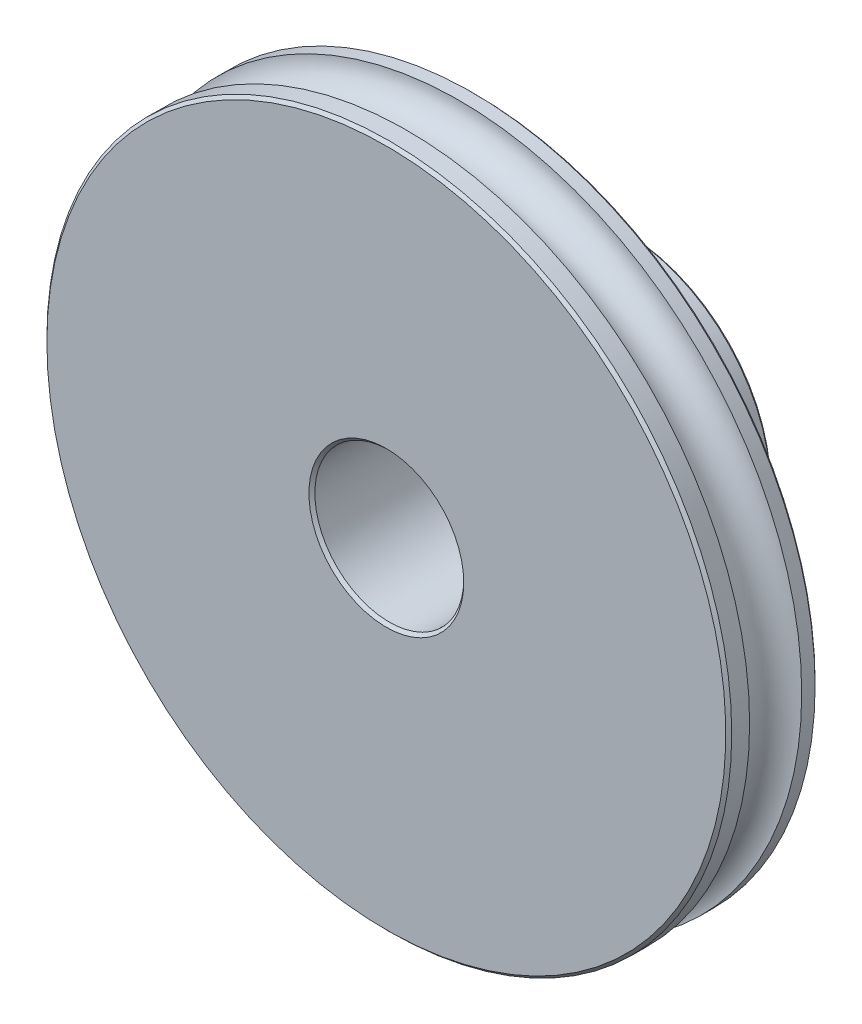
ISO-10303-21;
HEADER;
FILE_DESCRIPTION(('STEP AP214'),'2;1');
FILE_NAME('part.step','',(''),(''),'','','');
FILE_SCHEMA(('AUTOMOTIVE_DESIGN { 1 0 10303 214 1 1 1 1 }'));
ENDSEC;
DATA;
#1=APPLICATION_CONTEXT('core data for automotive mechanical design processes');
#2=APPLICATION_PROTOCOL_DEFINITION('international standard','automotive_design',2000,#1);
#3=PRODUCT_CONTEXT('',#1,'mechanical');
#4=PRODUCT('Part','Part','',(#3));
#5=PRODUCT_RELATED_PRODUCT_CATEGORY('part','',(#4));
#6=PRODUCT_DEFINITION_FORMATION('','',#4);
#7=PRODUCT_DEFINITION_CONTEXT('part definition',#1,'design');
#8=PRODUCT_DEFINITION('design','',#6,#7);
#9=PRODUCT_DEFINITION_SHAPE('','',#8);
#10=(LENGTH_UNIT() NAMED_UNIT(*) SI_UNIT(.MILLI.,.METRE.));
#11=(NAMED_UNIT(*) PLANE_ANGLE_UNIT() SI_UNIT($,.RADIAN.));
#12=(NAMED_UNIT(*) SI_UNIT($,.STERADIAN.) SOLID_ANGLE_UNIT());
#13=UNCERTAINTY_MEASURE_WITH_UNIT(LENGTH_MEASURE(1.E-05),#10,'distance_accuracy_value','');
#14=(GEOMETRIC_REPRESENTATION_CONTEXT(3) GLOBAL_UNCERTAINTY_ASSIGNED_CONTEXT((#13)) GLOBAL_UNIT_ASSIGNED_CONTEXT((#10,
#11,#12)) REPRESENTATION_CONTEXT('',''));
#15=CARTESIAN_POINT('',(0.,0.,0.));
#16=DIRECTION('',(0.,0.,1.));
#17=DIRECTION('',(1.,0.,0.));
#18=AXIS2_PLACEMENT_3D('',#15,#16,#17);
#19=CARTESIAN_POINT('',(0.,23.,-0.861588835659818));
#20=DIRECTION('',(0.,0.,-1.));
#21=DIRECTION('',(-1.,0.,0.));
#22=AXIS2_PLACEMENT_3D('',#19,#20,#21);
#23=PLANE('',#22);
#24=CARTESIAN_POINT('',(0.,0.,-0.861588835659818));
#25=DIRECTION('',(0.,0.,-1.));
#26=DIRECTION('',(-1.,0.,0.));
#27=AXIS2_PLACEMENT_3D('',#24,#25,#26);
#28=CIRCLE('',#27,22.8);
#29=CARTESIAN_POINT('',(-22.8,0.,-0.861588835659818));
#30=VERTEX_POINT('',#29);
#31=EDGE_CURVE('E70',#30,#30,#28,.F.);
#32=ORIENTED_EDGE('',*,*,#31,.T.);
#33=EDGE_LOOP('',(#32));
#34=FACE_BOUND('',#33,.T.);
#35=CARTESIAN_POINT('',(0.,0.,-0.861588835659818));
#36=DIRECTION('',(0.,0.,-1.));
#37=DIRECTION('',(-1.,0.,0.));
#38=AXIS2_PLACEMENT_3D('',#35,#36,#37);
#39=CIRCLE('',#38,5.20000000000002);
#40=CARTESIAN_POINT('',(5.20000000000002,0.,-0.861588835659817));
#41=VERTEX_POINT('',#40);
#42=EDGE_CURVE('E73',#41,#41,#39,.T.);
#43=ORIENTED_EDGE('',*,*,#42,.T.);
#44=EDGE_LOOP('',(#43));
#45=FACE_BOUND('',#44,.T.);
#46=ADVANCED_FACE('F32',(#34,#45),#23,.F.);
#47=CARTESIAN_POINT('',(0.,0.,0.));
#48=DIRECTION('',(0.,0.,1.));
#49=DIRECTION('',(1.,0.,0.));
#50=AXIS2_PLACEMENT_3D('',#47,#48,#49);
#51=CYLINDRICAL_SURFACE('',#50,5.);
#52=CARTESIAN_POINT('',(0.,0.,-1.06158883565983));
#53=DIRECTION('',(0.,0.,-1.));
#54=DIRECTION('',(-1.,0.,0.));
#55=AXIS2_PLACEMENT_3D('',#52,#53,#54);
#56=CIRCLE('',#55,5.);
#57=CARTESIAN_POINT('',(5.,0.,-1.06158883565983));
#58=VERTEX_POINT('',#57);
#59=EDGE_CURVE('E61',#58,#58,#56,.F.);
#60=ORIENTED_EDGE('',*,*,#59,.T.);
#61=EDGE_LOOP('',(#60));
#62=FACE_BOUND('',#61,.T.);
#63=CARTESIAN_POINT('',(0.,0.,-16.6615888356598));
#64=DIRECTION('',(0.,0.,1.));
#65=DIRECTION('',(1.,0.,0.));
#66=AXIS2_PLACEMENT_3D('',#63,#64,#65);
#67=CIRCLE('',#66,5.);
#68=CARTESIAN_POINT('',(5.,0.,-16.6615888356598));
#69=VERTEX_POINT('',#68);
#70=EDGE_CURVE('E64',#69,#69,#67,.F.);
#71=ORIENTED_EDGE('',*,*,#70,.T.);
#72=EDGE_LOOP('',(#71));
#73=FACE_BOUND('',#72,.T.);
#74=CARTESIAN_POINT('',(-4.96862696659688,-0.559237039909071,-12.));
#75=CARTESIAN_POINT('',(-4.96862859249291,-0.559243289457601,-12.107123689713));
#76=CARTESIAN_POINT('',(-4.96759621596919,-0.568639638396946,-12.2144262943318));
#77=CARTESIAN_POINT('',(-4.96321242143705,-0.605685583446096,-12.4259390840996));
#78=CARTESIAN_POINT('',(-4.95985507656293,-0.633381821781542,-12.5301406543385));
#79=CARTESIAN_POINT('',(-4.95013279271216,-0.70532671319419,-12.7320518089708));
#80=CARTESIAN_POINT('',(-4.94377916366208,-0.749512992354578,-12.8297842432912));
#81=CARTESIAN_POINT('',(-4.92709439411533,-0.85231571948194,-13.0168853548623));
#82=CARTESIAN_POINT('',(-4.91676412185841,-0.9109290165217,-13.1062558525241));
#83=CARTESIAN_POINT('',(-4.89035131426753,-1.04368028807413,-13.2792603145443));
#84=CARTESIAN_POINT('',(-4.87399824176396,-1.11846574971558,-13.3623563993972));
#85=CARTESIAN_POINT('',(-4.83440103494086,-1.27882094162444,-13.5155290208558));
#86=CARTESIAN_POINT('',(-4.81115449983773,-1.36439442305267,-13.5856010077097));
#87=CARTESIAN_POINT('',(-4.75562894304013,-1.54707720153733,-13.7134063903097));
#88=CARTESIAN_POINT('',(-4.72302989904364,-1.64450832144093,-13.7705442996859));
#89=CARTESIAN_POINT('',(-4.64854037386128,-1.84457044548736,-13.8668435701738));
#90=CARTESIAN_POINT('',(-4.6066536838339,-1.94719931479035,-13.9060122462489));
#91=CARTESIAN_POINT('',(-4.51595175553996,-2.1489086146871,-13.9633414859931));
#92=CARTESIAN_POINT('',(-4.46757012568838,-2.2479202913434,-13.9824273139702));
#93=CARTESIAN_POINT('',(-4.36345569416926,-2.44387925487172,-14.0020284857814));
#94=CARTESIAN_POINT('',(-4.30772564210192,-2.54082729822334,-14.0025507559658));
#95=CARTESIAN_POINT('',(-4.19400482275432,-2.72420981621286,-13.9855172301958));
#96=CARTESIAN_POINT('',(-4.13631687002834,-2.81092896033634,-13.9689752272453));
#97=CARTESIAN_POINT('',(-4.01800452803478,-2.97759784178477,-13.920007123697));
#98=CARTESIAN_POINT('',(-3.95737992359995,-3.05754708189868,-13.8875798576015));
#99=CARTESIAN_POINT('',(-3.83456466878181,-3.21027565791072,-13.8073635171217));
#100=CARTESIAN_POINT('',(-3.77236418658483,-3.28292877350629,-13.7593502851846));
#101=CARTESIAN_POINT('',(-3.64976595242591,-3.41871163826879,-13.6495349930808));
#102=CARTESIAN_POINT('',(-3.58936882639931,-3.4818381109155,-13.5877282068998));
#103=CARTESIAN_POINT('',(-3.46905503463101,-3.60185316928892,-13.4473508640561));
#104=CARTESIAN_POINT('',(-3.40943025780958,-3.65806009884632,-13.3679461074272));
#105=CARTESIAN_POINT('',(-3.29811057891565,-3.75873812780293,-13.197009428168));
#106=CARTESIAN_POINT('',(-3.24641827407092,-3.80320538685062,-13.1054735518044));
#107=CARTESIAN_POINT('',(-3.15272569749143,-3.88125685779727,-12.9095809776261));
#108=CARTESIAN_POINT('',(-3.11104043534905,-3.91449818272839,-12.8049351696613));
#109=CARTESIAN_POINT('',(-3.04247573937433,-3.96802924548966,-12.5877845096878));
#110=CARTESIAN_POINT('',(-3.01558669013471,-3.98832739588443,-12.4752848152734));
#111=CARTESIAN_POINT('',(-2.98010480472115,-4.01490226039714,-12.2529642225326));
#112=CARTESIAN_POINT('',(-2.97049456344194,-4.02195982163418,-12.1433995528714));
#113=CARTESIAN_POINT('',(-2.96725678579678,-4.02435044527722,-11.9239227922404));
#114=CARTESIAN_POINT('',(-2.97362440268529,-4.01968706312966,-11.8140108167243));
#115=CARTESIAN_POINT('',(-3.00095371759313,-3.99931657714825,-11.6035410650431));
#116=CARTESIAN_POINT('',(-3.021063545454,-3.98425360234552,-11.5028070625999));
#117=CARTESIAN_POINT('',(-3.07350026197023,-3.94394240973809,-11.3067115952145));
#118=CARTESIAN_POINT('',(-3.10582985946177,-3.91869193351965,-11.2113513268928));
#119=CARTESIAN_POINT('',(-3.18218773107586,-3.8569648077563,-11.0243976422043));
#120=CARTESIAN_POINT('',(-3.22663725727738,-3.82007442558442,-10.9331138113055));
#121=CARTESIAN_POINT('',(-3.32401030240626,-3.73565297450585,-10.7605170125584));
#122=CARTESIAN_POINT('',(-3.37693727064028,-3.68811757119895,-10.6792081272046));
#123=CARTESIAN_POINT('',(-3.4928053256039,-3.57870203453521,-10.5226265914006));
#124=CARTESIAN_POINT('',(-3.55619733398468,-3.51602168150221,-10.4482434347084));
#125=CARTESIAN_POINT('',(-3.68656563057476,-3.37907691375795,-10.3148229233902));
#126=CARTESIAN_POINT('',(-3.75354206454602,-3.30481202772203,-10.2557861934049));
#127=CARTESIAN_POINT('',(-3.88788450325421,-3.14566082441182,-10.1549523735367));
#128=CARTESIAN_POINT('',(-3.95525041079032,-3.0607770566667,-10.1131511558263));
#129=CARTESIAN_POINT('',(-4.0872394325019,-2.8821479095858,-10.0484511476002));
#130=CARTESIAN_POINT('',(-4.1518640171144,-2.78840737036291,-10.0255420985893));
#131=CARTESIAN_POINT('',(-4.27153696952286,-2.60106110661478,-10.0004952983472));
#132=CARTESIAN_POINT('',(-4.32693503487839,-2.50784561353572,-9.99709987143798));
#133=CARTESIAN_POINT('',(-4.43112498401762,-2.31878724046807,-10.0078554793835));
#134=CARTESIAN_POINT('',(-4.47991786656695,-2.22294476034596,-10.0220038581556));
#135=CARTESIAN_POINT('',(-4.56844910794051,-2.03464430089105,-10.0665467879999));
#136=CARTESIAN_POINT('',(-4.60841956077259,-1.94217279212759,-10.0964289447566));
#137=CARTESIAN_POINT('',(-4.68088676642558,-1.76036525142128,-10.1710528058811));
#138=CARTESIAN_POINT('',(-4.71338213892729,-1.67102980114745,-10.2157972509391));
#139=CARTESIAN_POINT('',(-4.77246219380611,-1.49421489536353,-10.3211031933532));
#140=CARTESIAN_POINT('',(-4.7987222242418,-1.40699190994729,-10.3822762753251));
#141=CARTESIAN_POINT('',(-4.84421358529409,-1.24136399209685,-10.517788538747));
#142=CARTESIAN_POINT('',(-4.86344199661961,-1.16296273147568,-10.5921331696082));
#143=CARTESIAN_POINT('',(-4.89695027623542,-1.01298866677542,-10.7573151468487));
#144=CARTESIAN_POINT('',(-4.91085011124483,-0.942139043530617,-10.8488885751441));
#145=CARTESIAN_POINT('',(-4.93335274446912,-0.816175531935121,-11.0429424357208));
#146=CARTESIAN_POINT('',(-4.94195492002078,-0.761063493718014,-11.1454241484536));
#147=CARTESIAN_POINT('',(-4.9546049978455,-0.673550697078195,-11.3490361864702));
#148=CARTESIAN_POINT('',(-4.95899247857216,-0.639555006369417,-11.4494616027124));
#149=CARTESIAN_POINT('',(-4.96527752472518,-0.588803574178576,-11.6544890414926));
#150=CARTESIAN_POINT('',(-4.96718203208046,-0.571999795802154,-11.7590785734244));
#151=CARTESIAN_POINT('',(-4.96825013552166,-0.562573619407354,-11.8867782391115));
#152=CARTESIAN_POINT('',(-4.96839174932971,-0.561323680600633,-11.9094014803564));
#153=CARTESIAN_POINT('',(-4.96857999635686,-0.559654699294009,-11.9546804767972));
#154=CARTESIAN_POINT('',(-4.96862662261203,-0.559235717715033,-11.9773362342552));
#155=CARTESIAN_POINT('',(-4.96862696659688,-0.559237039909071,-12.));
#156=B_SPLINE_CURVE_WITH_KNOTS('',3,(#74,#75,#76,#77,#78,#79,#80,#81,#82,#83,#84,#85,#86,#87,
#88,#89,#90,#91,#92,#93,#94,#95,#96,#97,#98,#99,#100,#101,#102,#103,#104,#105,#106,#107,#108,
#109,#110,#111,#112,#113,#114,#115,#116,#117,#118,#119,#120,#121,#122,#123,#124,#125,#126,#127,
#128,#129,#130,#131,#132,#133,#134,#135,#136,#137,#138,#139,#140,#141,#142,#143,#144,#145,#146,
#147,#148,#149,#150,#151,#152,#153,#154,#155),.UNSPECIFIED.,.T.,.F.,(4,2,2,2,2,2,2,2,2,2,2,2,2,
2,2,2,2,2,2,2,2,2,2,2,2,2,2,2,2,2,2,2,2,2,2,2,2,2,2,2,4),(0.,0.321277648767652,
0.643377335822245,0.96427082329339,1.28509428823861,1.62255618284425,1.96013574348342,
2.31102669091428,2.6617746696948,2.99554182887183,3.32918445305671,3.64408644830302,
3.95901155129059,4.27868300234897,4.5984641494003,4.93924044081355,5.28012807127126,
5.63064458717256,5.980933048001,6.30982147524419,6.63861014907938,6.94867248085144,
7.25880358651636,7.58151154652699,7.90435114525848,8.25103734246978,8.59773764852746,
8.9443548731281,9.29078375954134,9.61461039755951,9.93838801512599,10.2522199444335,
10.5661097782858,10.8938705113992,11.221767165642,11.5699625328561,11.9181988175919,
12.2351666081907,12.5512463021924,12.619212852096,12.6871843847255),.UNSPECIFIED.);
#157=CARTESIAN_POINT('',(-4.96862696659688,-0.559237039909071,-12.));
#158=VERTEX_POINT('',#157);
#159=EDGE_CURVE('E77',#158,#158,#156,.T.);
#160=ORIENTED_EDGE('',*,*,#159,.T.);
#161=EDGE_LOOP('',(#160));
#162=FACE_BOUND('',#161,.T.);
#163=CARTESIAN_POINT('',(0.,5.,-14.));
#164=CARTESIAN_POINT('',(-0.107493005442891,4.99999271227085,-13.9999901481763));
#165=CARTESIAN_POINT('',(-0.215172564090673,4.99649294306933,-13.9912822479116));
#166=CARTESIAN_POINT('',(-0.427496480417894,4.98283453100642,-13.9567522964788));
#167=CARTESIAN_POINT('',(-0.532131777561246,4.97265778698877,-13.9308837209139));
#168=CARTESIAN_POINT('',(-0.7349539227274,4.94674209213119,-13.8631239219412));
#169=CARTESIAN_POINT('',(-0.833160661616956,4.93102136364072,-13.8212851537833));
#170=CARTESIAN_POINT('',(-1.02107197032836,4.89556610796078,-13.7229808266734));
#171=CARTESIAN_POINT('',(-1.11077947675099,4.87583297458057,-13.6665203450811));
#172=CARTESIAN_POINT('',(-1.28350100757039,4.83330886170419,-13.5377645014391));
#173=CARTESIAN_POINT('',(-1.36606227255021,4.81042296929191,-13.4648933437597));
#174=CARTESIAN_POINT('',(-1.51817500478472,4.76460576906195,-13.3065999965232));
#175=CARTESIAN_POINT('',(-1.58772010713353,4.74167444453793,-13.2211717027883));
#176=CARTESIAN_POINT('',(-1.71487456729287,4.69722791797137,-13.0355719297577));
#177=CARTESIAN_POINT('',(-1.77181498119547,4.67582115964952,-12.9349135139768));
#178=CARTESIAN_POINT('',(-1.86775471903714,4.63833647186793,-12.72446360158));
#179=CARTESIAN_POINT('',(-1.90676256428583,4.62225601244176,-12.6146764721516));
#180=CARTESIAN_POINT('',(-1.96389882339586,4.59826357660819,-12.3942876664079));
#181=CARTESIAN_POINT('',(-1.98289396580564,4.59001420355605,-12.2839487644238));
#182=CARTESIAN_POINT('',(-2.00217296164002,4.58164004049144,-12.0613650016927));
#183=CARTESIAN_POINT('',(-2.00246601631321,4.58151125522769,-11.949121105375));
#184=CARTESIAN_POINT('',(-1.98498936750454,4.58910500279995,-11.734243328542));
#185=CARTESIAN_POINT('',(-1.96847531430513,4.5962817503845,-11.631484285591));
#186=CARTESIAN_POINT('',(-1.91994688029781,4.61676187607836,-11.4303404439933));
#187=CARTESIAN_POINT('',(-1.88792979480462,4.63006632321673,-11.3319564118897));
#188=CARTESIAN_POINT('',(-1.80869473255107,4.66159485088531,-11.139982163804));
#189=CARTESIAN_POINT('',(-1.76117986231531,4.67991379280788,-11.0465307609453));
#190=CARTESIAN_POINT('',(-1.65250646073221,4.7193811638989,-10.8685841836384));
#191=CARTESIAN_POINT('',(-1.59134280510084,4.74053065456849,-10.7840923905972));
#192=CARTESIAN_POINT('',(-1.45155059945443,4.78526736742271,-10.619590271198));
#193=CARTESIAN_POINT('',(-1.37193746297063,4.80891664976152,-10.540431270554));
#194=CARTESIAN_POINT('',(-1.20031442743019,4.85459824958282,-10.396315521998));
#195=CARTESIAN_POINT('',(-1.10830206533443,4.87663024445325,-10.3313616025897));
#196=CARTESIAN_POINT('',(-0.912077652605838,4.91714681264549,-10.2163825525842));
#197=CARTESIAN_POINT('',(-0.807660491346473,4.93555270095415,-10.166677718803));
#198=CARTESIAN_POINT('',(-0.591023765482878,4.96614828328759,-10.085832138922));
#199=CARTESIAN_POINT('',(-0.478808196849671,4.97834113462382,-10.0546819624426));
#200=CARTESIAN_POINT('',(-0.256895887607818,4.99456139506911,-10.0135517045803));
#201=CARTESIAN_POINT('',(-0.147443293985533,4.99902945833514,-10.0024275457464));
#202=CARTESIAN_POINT('',(0.0718453098078181,5.00068478510631,-9.99828689947139));
#203=CARTESIAN_POINT('',(0.181681213223924,4.99787393582292,-10.0052657184525));
#204=CARTESIAN_POINT('',(0.393432739121988,4.98557567063753,-10.036291752552));
#205=CARTESIAN_POINT('',(0.495482491775474,4.97639391345523,-10.059557980351));
#206=CARTESIAN_POINT('',(0.69413542806078,4.952594414055,-10.1214357083098));
#207=CARTESIAN_POINT('',(0.790737910224844,4.93797597356531,-10.1600491796687));
#208=CARTESIAN_POINT('',(0.9790787858167,4.90416594770812,-10.25278493968));
#209=CARTESIAN_POINT('',(1.0705780227554,4.88484815979804,-10.3073454720432));
#210=CARTESIAN_POINT('',(1.24344359124655,4.84373364745525,-10.4299403239057));
#211=CARTESIAN_POINT('',(1.32480584076112,4.82193593110271,-10.4979800429226));
#212=CARTESIAN_POINT('',(1.48072304302881,4.77645117638112,-10.6508700129496));
#213=CARTESIAN_POINT('',(1.55447393380606,4.75273441425052,-10.7365335415062));
#214=CARTESIAN_POINT('',(1.68675119741371,4.70741672917132,-10.9194400830094));
#215=CARTESIAN_POINT('',(1.7452750613375,4.68581615526511,-11.01668500034));
#216=CARTESIAN_POINT('',(1.84580750193162,4.64714299907709,-11.2214616945941));
#217=CARTESIAN_POINT('',(1.88765059453445,4.63011630884788,-11.3290839992123));
#218=CARTESIAN_POINT('',(1.9522962197053,4.60323673477932,-11.5507336517152));
#219=CARTESIAN_POINT('',(1.97511280526931,4.59337855695999,-11.6647562058124));
#220=CARTESIAN_POINT('',(1.99971561727839,4.58271759299927,-11.8871279017745));
#221=CARTESIAN_POINT('',(2.00289708230286,4.58131421008172,-11.9952948395934));
#222=CARTESIAN_POINT('',(1.99180315927752,4.58614836033098,-12.2105448577133));
#223=CARTESIAN_POINT('',(1.97752998791377,4.59238492324794,-12.3176280739026));
#224=CARTESIAN_POINT('',(1.93307136615364,4.61126649079021,-12.523332189855));
#225=CARTESIAN_POINT('',(1.90353749357097,4.6236483182745,-12.622120274433));
#226=CARTESIAN_POINT('',(1.83000544849101,4.65324001232697,-12.8133786296135));
#227=CARTESIAN_POINT('',(1.78600328139381,4.67045121206007,-12.9058471468998));
#228=CARTESIAN_POINT('',(1.68187276275972,4.70898609604492,-13.0876096192708));
#229=CARTESIAN_POINT('',(1.62096533515948,4.73048882313242,-13.1764186701305));
#230=CARTESIAN_POINT('',(1.48589211927149,4.77463804372237,-13.3429933172038));
#231=CARTESIAN_POINT('',(1.41172233481811,4.79728488048407,-13.4207555721283));
#232=CARTESIAN_POINT('',(1.24650550627246,4.84293567087394,-13.5682028532636));
#233=CARTESIAN_POINT('',(1.15467600114613,4.86586757962186,-13.6370373068981));
#234=CARTESIAN_POINT('',(0.959900320285774,4.90800406713717,-13.7583370426216));
#235=CARTESIAN_POINT('',(0.856949004547232,4.92720691092906,-13.8107947121525));
#236=CARTESIAN_POINT('',(0.644738062495198,4.95939714815861,-13.8966222151903));
#237=CARTESIAN_POINT('',(0.535631618219692,4.97249363055028,-13.9303293235603));
#238=CARTESIAN_POINT('',(0.312876546281217,4.99144306209366,-13.9786391209543));
#239=CARTESIAN_POINT('',(0.199243525858909,4.99731899495638,-13.9933024367439));
#240=CARTESIAN_POINT('',(0.0569122978909277,4.99975899504137,-13.9993953809783));
#241=CARTESIAN_POINT('',(0.0284626887407574,5.00000192969176,-14.0000026086292));
#242=CARTESIAN_POINT('',(0.,5.,-14.));
#243=B_SPLINE_CURVE_WITH_KNOTS('',3,(#163,#164,#165,#166,#167,#168,#169,#170,#171,#172,#173,
#174,#175,#176,#177,#178,#179,#180,#181,#182,#183,#184,#185,#186,#187,#188,#189,#190,#191,#192,
#193,#194,#195,#196,#197,#198,#199,#200,#201,#202,#203,#204,#205,#206,#207,#208,#209,#210,#211,
#212,#213,#214,#215,#216,#217,#218,#219,#220,#221,#222,#223,#224,#225,#226,#227,#228,#229,#230,
#231,#232,#233,#234,#235,#236,#237,#238,#239,#240,#241,#242),.UNSPECIFIED.,.T.,.F.,(4,2,2,2,2,2,
2,2,2,2,2,2,2,2,2,2,2,2,2,2,2,2,2,2,2,2,2,2,2,2,2,2,2,2,2,2,2,2,2,4),(0.,0.32240298789307,
0.645683636007933,0.967911457471578,1.29002753567984,1.62597381700397,1.96208394934411,
2.31315258819216,2.66405423118267,2.99904105308828,3.33386306340487,3.64538328401371,
3.95695787256046,4.27489126298814,4.59294421938182,4.93558349186555,5.27829092839731,
5.62776913162804,5.97706956113788,6.30569184528005,6.6342289357008,6.94800455564363,
7.26182048993794,7.5852351339826,7.90877959498966,8.2536847462441,8.59864669043745,
8.94695045140825,9.2949967264593,9.61799673392744,9.94095572563042,10.2511431854877,
10.5614163580516,10.8894546805669,11.2175920134839,11.5670042353383,11.9165786364053,
12.2596430101331,12.6016125240434,12.6869804589679),.UNSPECIFIED.);
#244=CARTESIAN_POINT('',(0.,5.,-14.));
#245=VERTEX_POINT('',#244);
#246=EDGE_CURVE('E112',#245,#245,#243,.T.);
#247=ORIENTED_EDGE('',*,*,#246,.T.);
#248=EDGE_LOOP('',(#247));
#249=FACE_BOUND('',#248,.T.);
#250=ADVANCED_FACE('F93',(#62,#73,#162,#249),#51,.F.);
#251=CARTESIAN_POINT('',(0.,10.,-16.8615888356598));
#252=DIRECTION('',(0.,0.,1.));
#253=DIRECTION('',(1.,0.,0.));
#254=AXIS2_PLACEMENT_3D('',#251,#252,#253);
#255=PLANE('',#254);
#256=CARTESIAN_POINT('',(0.,0.,-16.8615888356598));
#257=DIRECTION('',(0.,0.,1.));
#258=DIRECTION('',(1.,0.,0.));
#259=AXIS2_PLACEMENT_3D('',#256,#257,#258);
#260=CIRCLE('',#259,5.20000000000001);
#261=CARTESIAN_POINT('',(5.20000000000001,0.,-16.8615888356598));
#262=VERTEX_POINT('',#261);
#263=EDGE_CURVE('E55',#262,#262,#260,.T.);
#264=ORIENTED_EDGE('',*,*,#263,.T.);
#265=EDGE_LOOP('',(#264));
#266=FACE_BOUND('',#265,.T.);
#267=CARTESIAN_POINT('',(0.,0.,-16.8615888356598));
#268=DIRECTION('',(0.,0.,1.));
#269=DIRECTION('',(1.,0.,0.));
#270=AXIS2_PLACEMENT_3D('',#267,#268,#269);
#271=CIRCLE('',#270,9.8);
#272=CARTESIAN_POINT('',(9.8,0.,-16.8615888356598));
#273=VERTEX_POINT('',#272);
#274=EDGE_CURVE('E58',#273,#273,#271,.F.);
#275=ORIENTED_EDGE('',*,*,#274,.T.);
#276=EDGE_LOOP('',(#275));
#277=FACE_BOUND('',#276,.T.);
#278=ADVANCED_FACE('F122',(#266,#277),#255,.F.);
#279=CARTESIAN_POINT('',(0.,0.,0.));
#280=DIRECTION('',(0.,0.,1.));
#281=DIRECTION('',(1.,0.,0.));
#282=AXIS2_PLACEMENT_3D('',#279,#280,#281);
#283=CYLINDRICAL_SURFACE('',#282,10.);
#284=CARTESIAN_POINT('',(0.,0.,-7.36158883565981));
#285=DIRECTION('',(0.,0.,1.));
#286=DIRECTION('',(1.,0.,0.));
#287=AXIS2_PLACEMENT_3D('',#284,#285,#286);
#288=CIRCLE('',#287,10.);
#289=CARTESIAN_POINT('',(10.,0.,-7.36158883565981));
#290=VERTEX_POINT('',#289);
#291=EDGE_CURVE('E10',#290,#290,#288,.F.);
#292=ORIENTED_EDGE('',*,*,#291,.T.);
#293=EDGE_LOOP('',(#292));
#294=FACE_BOUND('',#293,.T.);
#295=CARTESIAN_POINT('',(0.,0.,-16.6615888356598));
#296=DIRECTION('',(0.,0.,1.));
#297=DIRECTION('',(1.,0.,0.));
#298=AXIS2_PLACEMENT_3D('',#295,#296,#297);
#299=CIRCLE('',#298,10.);
#300=CARTESIAN_POINT('',(10.,0.,-16.6615888356598));
#301=VERTEX_POINT('',#300);
#302=EDGE_CURVE('E52',#301,#301,#299,.T.);
#303=ORIENTED_EDGE('',*,*,#302,.T.);
#304=EDGE_LOOP('',(#303));
#305=FACE_BOUND('',#304,.T.);
#306=CARTESIAN_POINT('',(-9.48528137423855,-3.16692867799753,-12.));
#307=CARTESIAN_POINT('',(-9.48528123351054,-3.16693334054603,-11.8888712490177));
#308=CARTESIAN_POINT('',(-9.48228968872125,-3.17593281779641,-11.7776907533333));
#309=CARTESIAN_POINT('',(-9.47027337602944,-3.21158260334518,-11.5584749897137));
#310=CARTESIAN_POINT('',(-9.4612437805391,-3.23824703510274,-11.450442310728));
#311=CARTESIAN_POINT('',(-9.43703471281893,-3.30813135348063,-11.2407253932916));
#312=CARTESIAN_POINT('',(-9.42186135675276,-3.35133477307741,-11.1390349569348));
#313=CARTESIAN_POINT('',(-9.38519852753008,-3.45267129042365,-10.9446503106061));
#314=CARTESIAN_POINT('',(-9.36370940688623,-3.51080355490087,-10.8519555989242));
#315=CARTESIAN_POINT('',(-9.31394442102499,-3.64078703168214,-10.6768779922923));
#316=CARTESIAN_POINT('',(-9.28558592076343,-3.71280292068137,-10.5946408242321));
#317=CARTESIAN_POINT('',(-9.22216802626156,-3.86763531468174,-10.444084932842));
#318=CARTESIAN_POINT('',(-9.18710816263645,-3.95045257611619,-10.3757671851656));
#319=CARTESIAN_POINT('',(-9.11009460975993,-4.12496513083892,-10.2544239647431));
#320=CARTESIAN_POINT('',(-9.06808349627204,-4.21673151484204,-10.2015369723667));
#321=CARTESIAN_POINT('',(-8.97786250797459,-4.40555546816553,-10.1134501259037));
#322=CARTESIAN_POINT('',(-8.92965321393597,-4.50261254125695,-10.078248616198));
#323=CARTESIAN_POINT('',(-8.82859982842876,-4.69762936500425,-10.0269856127608));
#324=CARTESIAN_POINT('',(-8.7758251734017,-4.79556037285138,-10.010678044858));
#325=CARTESIAN_POINT('',(-8.66640817689221,-4.99057756583646,-9.99689809632337));
#326=CARTESIAN_POINT('',(-8.60976620862631,-5.08766383147992,-9.99942390070836));
#327=CARTESIAN_POINT('',(-8.495135852387,-5.27681048120639,-10.0230523604311));
#328=CARTESIAN_POINT('',(-8.43717812551715,-5.36892274872908,-10.0438899543357));
#329=CARTESIAN_POINT('',(-8.32106640761473,-5.54717729523298,-10.1031300649178));
#330=CARTESIAN_POINT('',(-8.26291240882187,-5.63331933519073,-10.1415332843838));
#331=CARTESIAN_POINT('',(-8.1481362124073,-5.79810593391705,-10.2350600802945));
#332=CARTESIAN_POINT('',(-8.09152597765115,-5.8766998229537,-10.2902875022098));
#333=CARTESIAN_POINT('',(-7.98240521822526,-6.02408737438232,-10.4158181544732));
#334=CARTESIAN_POINT('',(-7.92989516624376,-6.09287990757984,-10.486123119541));
#335=CARTESIAN_POINT('',(-7.83026895122232,-6.22041491413224,-10.6412672442169));
#336=CARTESIAN_POINT('',(-7.78326275505251,-6.27896131789116,-10.7263383734592));
#337=CARTESIAN_POINT('',(-7.69786036329994,-6.38337760514429,-10.9078328849015));
#338=CARTESIAN_POINT('',(-7.6594643305674,-6.42924724887763,-11.0042564817664));
#339=CARTESIAN_POINT('',(-7.59308667547661,-6.50750999071718,-11.2060416636436));
#340=CARTESIAN_POINT('',(-7.56512751692454,-6.53987403749125,-11.3114219352793));
#341=CARTESIAN_POINT('',(-7.52121860710734,-6.59032629050856,-11.527942647448));
#342=CARTESIAN_POINT('',(-7.50526729065417,-6.60841635733925,-11.6390823352382));
#343=CARTESIAN_POINT('',(-7.48641900902726,-6.62976108032842,-11.8619297159981));
#344=CARTESIAN_POINT('',(-7.48330333822819,-6.63326429202513,-11.9735951486207));
#345=CARTESIAN_POINT('',(-7.48969620286372,-6.62604507093847,-12.1960964463994));
#346=CARTESIAN_POINT('',(-7.49920402244195,-6.61532344482115,-12.3069323582377));
#347=CARTESIAN_POINT('',(-7.53017150402227,-6.58004966512264,-12.5235372805845));
#348=CARTESIAN_POINT('',(-7.55151568679344,-6.55563111690023,-12.6293446860715));
#349=CARTESIAN_POINT('',(-7.60497399236677,-6.4935382290474,-12.8341265580575));
#350=CARTESIAN_POINT('',(-7.63708900236078,-6.45586279743639,-12.9331004608714));
#351=CARTESIAN_POINT('',(-7.71101633172185,-6.36738417394592,-13.1228262199003));
#352=CARTESIAN_POINT('',(-7.75294959254877,-6.31641627178122,-13.2134540926017));
#353=CARTESIAN_POINT('',(-7.8443438866421,-6.20254678935902,-13.3826166240018));
#354=CARTESIAN_POINT('',(-7.8938056946005,-6.13964398082811,-13.4611500364985));
#355=CARTESIAN_POINT('',(-7.99893373352567,-6.00205420192555,-13.6051251183712));
#356=CARTESIAN_POINT('',(-8.05468355289221,-5.92720115584864,-13.6703473093));
#357=CARTESIAN_POINT('',(-8.16942934872276,-5.76801840431265,-13.7842917629992));
#358=CARTESIAN_POINT('',(-8.22842518874231,-5.68368909702722,-13.8330147186896));
#359=CARTESIAN_POINT('',(-8.3470088518381,-5.50804833983189,-13.9122577434933));
#360=CARTESIAN_POINT('',(-8.40659130834764,-5.41677990117905,-13.9428810364525));
#361=CARTESIAN_POINT('',(-8.5245225550375,-5.22922326191465,-13.9853824953277));
#362=CARTESIAN_POINT('',(-8.5828714929681,-5.13293566733867,-13.9972629189514));
#363=CARTESIAN_POINT('',(-8.69544806183321,-4.93978378049316,-14.0018539619258));
#364=CARTESIAN_POINT('',(-8.74972974023264,-4.84295867939381,-13.9948945609125));
#365=CARTESIAN_POINT('',(-8.85381723565921,-4.64994044932278,-13.9627320989043));
#366=CARTESIAN_POINT('',(-8.90362310895659,-4.55374731242007,-13.9375292673037));
#367=CARTESIAN_POINT('',(-8.99760497680732,-4.36511096833197,-13.8697420158168));
#368=CARTESIAN_POINT('',(-9.04179351360712,-4.27265973279036,-13.827197243738));
#369=CARTESIAN_POINT('',(-9.12404334185725,-4.09408224638992,-13.7259755173378));
#370=CARTESIAN_POINT('',(-9.16210414873275,-4.0079564960368,-13.667297288191));
#371=CARTESIAN_POINT('',(-9.23236944069186,-3.84337102074506,-13.5343612258774));
#372=CARTESIAN_POINT('',(-9.26446954358531,-3.76505738205183,-13.4598673272324));
#373=CARTESIAN_POINT('',(-9.3220060698264,-3.62026077490982,-13.2978995198025));
#374=CARTESIAN_POINT('',(-9.34744091316291,-3.55378061280259,-13.2104225410401));
#375=CARTESIAN_POINT('',(-9.39199316489977,-3.43432436341126,-13.0238413666191));
#376=CARTESIAN_POINT('',(-9.41103957384599,-3.38150144890644,-12.9246220777575));
#377=CARTESIAN_POINT('',(-9.44260191557335,-3.29234321163629,-12.7181344534798));
#378=CARTESIAN_POINT('',(-9.45512377355213,-3.25599293335471,-12.6108735226256));
#379=CARTESIAN_POINT('',(-9.47142834175558,-3.20819213734531,-12.4194750891143));
#380=CARTESIAN_POINT('',(-9.47662629608765,-3.19275316741718,-12.3364291609721));
#381=CARTESIAN_POINT('',(-9.48355280601722,-3.17211984207917,-12.1689320908977));
#382=CARTESIAN_POINT('',(-9.48528148122116,-3.16692513348951,-12.0844809975111));
#383=CARTESIAN_POINT('',(-9.48528137423855,-3.16692867799753,-12.));
#384=B_SPLINE_CURVE_WITH_KNOTS('',3,(#306,#307,#308,#309,#310,#311,#312,#313,#314,#315,#316,
#317,#318,#319,#320,#321,#322,#323,#324,#325,#326,#327,#328,#329,#330,#331,#332,#333,#334,#335,
#336,#337,#338,#339,#340,#341,#342,#343,#344,#345,#346,#347,#348,#349,#350,#351,#352,#353,#354,
#355,#356,#357,#358,#359,#360,#361,#362,#363,#364,#365,#366,#367,#368,#369,#370,#371,#372,#373,
#374,#375,#376,#377,#378,#379,#380,#381,#382,#383),.UNSPECIFIED.,.T.,.F.,(4,2,2,2,2,2,2,2,2,2,2,
2,2,2,2,2,2,2,2,2,2,2,2,2,2,2,2,2,2,2,2,2,2,2,2,2,2,2,4),(0.,0.333076927738854,
0.666420478568592,0.999432995881171,1.33242692971972,1.66964505096873,2.00688680070843,
2.347068008749,2.68721736493119,3.0228849776616,3.35852024232496,3.68937579267074,
4.020244581475,4.35319848444606,4.68619071540131,5.02498693524966,5.36378956245439,
5.70331726345552,6.04280070032048,6.37647515609186,6.71013069056842,7.04058683566636,
7.37107020708795,7.70586119549041,8.04068665740416,8.380652034669,8.72060313260208,
9.05859627157299,9.39654869383254,9.7286203482937,10.0606878273351,10.392000341509,
10.7233390426937,11.0600230405119,11.3967867777956,11.7371779715921,12.0772595018039,
12.3304760727632,12.5836839137096),.UNSPECIFIED.);
#385=CARTESIAN_POINT('',(-9.48528137423855,-3.16692867799753,-12.));
#386=VERTEX_POINT('',#385);
#387=EDGE_CURVE('E85',#386,#386,#384,.T.);
#388=ORIENTED_EDGE('',*,*,#387,.T.);
#389=EDGE_LOOP('',(#388));
#390=FACE_BOUND('',#389,.T.);
#391=CARTESIAN_POINT('',(0.,10.,-14.));
#392=CARTESIAN_POINT('',(0.111153813585266,9.99999795161742,-13.9999959110033));
#393=CARTESIAN_POINT('',(0.222359320403044,9.99812770356462,-13.9907023140647));
#394=CARTESIAN_POINT('',(0.441627015378037,9.99084731246462,-13.9538029997695));
#395=CARTESIAN_POINT('',(0.54968663508271,9.98543435720372,-13.926182734397));
#396=CARTESIAN_POINT('',(0.759460610526624,9.97167298556573,-13.8535174527584));
#397=CARTESIAN_POINT('',(0.861180935866265,9.96332738153436,-13.8084891263106));
#398=CARTESIAN_POINT('',(1.05561597772845,9.94460796070629,-13.7023355049774));
#399=CARTESIAN_POINT('',(1.14833123015162,9.93423426471414,-13.6412111687856));
#400=CARTESIAN_POINT('',(1.32338695462973,9.91244330659939,-13.5037230114171));
#401=CARTESIAN_POINT('',(1.40558790231704,9.90101491008695,-13.4271832892176));
#402=CARTESIAN_POINT('',(1.55607351321605,9.87848360905176,-13.2614151672166));
#403=CARTESIAN_POINT('',(1.62435708954084,9.86738073000848,-13.1721857773298));
#404=CARTESIAN_POINT('',(1.74566350669523,9.8466488362523,-12.9825676139762));
#405=CARTESIAN_POINT('',(1.79854187773173,9.83703414729892,-12.8820847124073));
#406=CARTESIAN_POINT('',(1.88661133316061,9.82052536116836,-12.6734363619918));
#407=CARTESIAN_POINT('',(1.92180416487447,9.81363099523923,-12.5652716733073));
#408=CARTESIAN_POINT('',(1.97305059976965,9.80345610504409,-12.3458312721842));
#409=CARTESIAN_POINT('',(1.98934899591755,9.80012940214375,-12.2346149117155));
#410=CARTESIAN_POINT('',(2.00310425545223,9.79732750121254,-12.0109803572713));
#411=CARTESIAN_POINT('',(2.00056304542699,9.79785190935681,-11.8985622873597));
#412=CARTESIAN_POINT('',(1.97690914620363,9.80265102296369,-11.677506423958));
#413=CARTESIAN_POINT('',(1.9560770804878,9.80686905717527,-11.5688371887454));
#414=CARTESIAN_POINT('',(1.89687576924609,9.81849092320002,-11.356567846674));
#415=CARTESIAN_POINT('',(1.85850568620136,9.82589490715557,-11.252967982162));
#416=CARTESIAN_POINT('',(1.76504956734943,9.84311237000816,-11.0529694765928));
#417=CARTESIAN_POINT('',(1.70985230246422,9.85294179627409,-10.9566242408617));
#418=CARTESIAN_POINT('',(1.58438714914535,9.87389237546124,-10.7744583000544));
#419=CARTESIAN_POINT('',(1.51411752871365,9.88501367676732,-10.6886388062977));
#420=CARTESIAN_POINT('',(1.35899986912116,9.90754042482924,-10.5283411950861));
#421=CARTESIAN_POINT('',(1.27391232242489,9.91894738421809,-10.4540948642817));
#422=CARTESIAN_POINT('',(1.09237004812402,9.94057697428817,-10.3208923073976));
#423=CARTESIAN_POINT('',(0.995915174758774,9.95079958977947,-10.2619362774128));
#424=CARTESIAN_POINT('',(0.794118773757838,9.96893380321774,-10.1609449815481));
#425=CARTESIAN_POINT('',(0.688763639170597,9.97684177696543,-10.1189362127109));
#426=CARTESIAN_POINT('',(0.472297952897328,9.98942817975716,-10.0532790519229));
#427=CARTESIAN_POINT('',(0.361188100144898,9.99410700001062,-10.0296284358528));
#428=CARTESIAN_POINT('',(0.1383588112543,9.99965343733735,-10.0016870924115));
#429=CARTESIAN_POINT('',(0.0266806566511522,10.0005834930494,-9.99707916091947));
#430=CARTESIAN_POINT('',(-0.195849868385428,9.99870103860205,-10.0064997178844));
#431=CARTESIAN_POINT('',(-0.306702284887586,9.99588873882892,-10.0205271587052));
#432=CARTESIAN_POINT('',(-0.523411319893081,9.98687664016035,-10.0665567470879));
#433=CARTESIAN_POINT('',(-0.629303896679805,9.98070752808413,-10.0983961369958));
#434=CARTESIAN_POINT('',(-0.834247254999332,9.96567104122065,-10.1789679653116));
#435=CARTESIAN_POINT('',(-0.933297523275077,9.95680346428453,-10.2277016693537));
#436=CARTESIAN_POINT('',(-1.12308234737243,9.93719823066589,-10.3413649813026));
#437=CARTESIAN_POINT('',(-1.21370025350437,9.92643900874103,-10.4064855620779));
#438=CARTESIAN_POINT('',(-1.38283603823841,9.90429469659765,-10.5508183824146));
#439=CARTESIAN_POINT('',(-1.46135261786152,9.89290953936776,-10.6300321327997));
#440=CARTESIAN_POINT('',(-1.60528118154835,9.8705860711393,-10.8017467037823));
#441=CARTESIAN_POINT('',(-1.67047540489731,9.85965720466608,-10.8944314884427));
#442=CARTESIAN_POINT('',(-1.78437084010241,9.83968383592388,-11.0896227227134));
#443=CARTESIAN_POINT('',(-1.8330727118458,9.83063925826685,-11.1921287791471));
#444=CARTESIAN_POINT('',(-1.91230368316391,9.81553481168766,-11.4035364922991));
#445=CARTESIAN_POINT('',(-1.94292699958209,9.80945949744373,-11.5124016824206));
#446=CARTESIAN_POINT('',(-1.98541730325439,9.8009487358405,-11.7338669069818));
#447=CARTESIAN_POINT('',(-1.99728673645022,9.79851281382223,-11.8464664524187));
#448=CARTESIAN_POINT('',(-2.00184182173493,9.79758299262758,-12.0700177290886));
#449=CARTESIAN_POINT('',(-1.99487157614178,9.79901838378602,-12.180962297854));
#450=CARTESIAN_POINT('',(-1.96270460820011,9.80551146969228,-12.4000632998101));
#451=CARTESIAN_POINT('',(-1.93750803225859,9.81056913534338,-12.5082197553896));
#452=CARTESIAN_POINT('',(-1.8697571369979,9.82370528438317,-12.7184554224811));
#453=CARTESIAN_POINT('',(-1.82724501343468,9.83177642037661,-12.8205487210048));
#454=CARTESIAN_POINT('',(-1.7261092892032,9.8500342994834,-13.0162074414689));
#455=CARTESIAN_POINT('',(-1.66748433754976,9.86022121997788,-13.1097721474503));
#456=CARTESIAN_POINT('',(-1.53461182957282,9.88177921046451,-13.2874311443006));
#457=CARTESIAN_POINT('',(-1.46011577447036,9.89316745819399,-13.3713375305352));
#458=CARTESIAN_POINT('',(-1.29812873802628,9.91572163743909,-13.5255724110583));
#459=CARTESIAN_POINT('',(-1.21063477430667,9.92688751726369,-13.5958977806345));
#460=CARTESIAN_POINT('',(-1.02403525817649,9.94787664775943,-13.7216692878929));
#461=CARTESIAN_POINT('',(-0.924817768859665,9.95768462438492,-13.77695200656));
#462=CARTESIAN_POINT('',(-0.718332721881462,9.9747025017,-13.8699722451932));
#463=CARTESIAN_POINT('',(-0.611072521726249,9.98191474277231,-13.907725579065));
#464=CARTESIAN_POINT('',(-0.419642977847556,9.99152745190741,-13.9573038960894));
#465=CARTESIAN_POINT('',(-0.336563328027567,9.99468606316903,-13.9732863874155));
#466=CARTESIAN_POINT('',(-0.168999050420133,9.99892308279785,-13.9946358247167));
#467=CARTESIAN_POINT('',(-0.0845144674972374,10.0000015574631,-14.0000031090195));
#468=CARTESIAN_POINT('',(0.,10.,-14.));
#469=B_SPLINE_CURVE_WITH_KNOTS('',3,(#391,#392,#393,#394,#395,#396,#397,#398,#399,#400,#401,
#402,#403,#404,#405,#406,#407,#408,#409,#410,#411,#412,#413,#414,#415,#416,#417,#418,#419,#420,
#421,#422,#423,#424,#425,#426,#427,#428,#429,#430,#431,#432,#433,#434,#435,#436,#437,#438,#439,
#440,#441,#442,#443,#444,#445,#446,#447,#448,#449,#450,#451,#452,#453,#454,#455,#456,#457,#458,
#459,#460,#461,#462,#463,#464,#465,#466,#467,#468),.UNSPECIFIED.,.T.,.F.,(4,2,2,2,2,2,2,2,2,2,2,
2,2,2,2,2,2,2,2,2,2,2,2,2,2,2,2,2,2,2,2,2,2,2,2,2,2,2,4),(0.,0.333152261322516,
0.666569301382644,0.99966747050068,1.33274580446172,1.66986534022437,2.00701119349472,
2.34722390011845,2.68740298730394,3.02312370207173,3.35881008562449,3.68943454012555,
4.02007478507458,4.35294980407183,4.68586309499339,5.02476504982699,5.36367135079638,
5.70310549708046,6.0424985139607,6.37621471352528,6.70991215315733,7.04060907901444,
7.37133078432042,7.70610132066715,8.04090776691857,8.38081257158448,8.7207037744693,
9.05880762065443,9.39686736660826,9.72879445135399,10.0607188698521,10.3918392250622,
10.7229873516373,11.0597615247828,11.3966130906586,11.7369899335127,12.0770591103503,
12.3303755057978,12.5836838274199),.UNSPECIFIED.);
#470=CARTESIAN_POINT('',(0.,10.,-14.));
#471=VERTEX_POINT('',#470);
#472=EDGE_CURVE('E86',#471,#471,#469,.T.);
#473=ORIENTED_EDGE('',*,*,#472,.T.);
#474=EDGE_LOOP('',(#473));
#475=FACE_BOUND('',#474,.T.);
#476=ADVANCED_FACE('F117',(#294,#305,#390,#475),#283,.T.);
#477=CARTESIAN_POINT('',(0.,23.,-6.86158883565982));
#478=DIRECTION('',(0.,0.,1.));
#479=DIRECTION('',(1.,0.,0.));
#480=AXIS2_PLACEMENT_3D('',#477,#478,#479);
#481=PLANE('',#480);
#482=CARTESIAN_POINT('',(0.,0.,-6.86158883565982));
#483=DIRECTION('',(0.,0.,1.));
#484=DIRECTION('',(1.,0.,0.));
#485=AXIS2_PLACEMENT_3D('',#482,#483,#484);
#486=CIRCLE('',#485,10.5);
#487=CARTESIAN_POINT('',(10.5,0.,-6.86158883565982));
#488=VERTEX_POINT('',#487);
#489=EDGE_CURVE('E39',#488,#488,#486,.T.);
#490=ORIENTED_EDGE('',*,*,#489,.T.);
#491=EDGE_LOOP('',(#490));
#492=FACE_BOUND('',#491,.T.);
#493=CARTESIAN_POINT('',(0.,0.,-6.86158883565982));
#494=DIRECTION('',(0.,0.,1.));
#495=DIRECTION('',(1.,0.,0.));
#496=AXIS2_PLACEMENT_3D('',#493,#494,#495);
#497=CIRCLE('',#496,22.8);
#498=CARTESIAN_POINT('',(22.8,0.,-6.86158883565982));
#499=VERTEX_POINT('',#498);
#500=EDGE_CURVE('E43',#499,#499,#497,.F.);
#501=ORIENTED_EDGE('',*,*,#500,.T.);
#502=EDGE_LOOP('',(#501));
#503=FACE_BOUND('',#502,.T.);
#504=ADVANCED_FACE('F121',(#492,#503),#481,.F.);
#505=CARTESIAN_POINT('',(0.,0.,0.));
#506=DIRECTION('',(0.,0.,1.));
#507=DIRECTION('',(1.,0.,0.));
#508=AXIS2_PLACEMENT_3D('',#505,#506,#507);
#509=CYLINDRICAL_SURFACE('',#508,23.);
#510=CARTESIAN_POINT('',(0.,0.,-6.66158883565981));
#511=DIRECTION('',(0.,0.,1.));
#512=DIRECTION('',(1.,0.,0.));
#513=AXIS2_PLACEMENT_3D('',#510,#511,#512);
#514=CIRCLE('',#513,23.);
#515=CARTESIAN_POINT('',(23.,0.,-6.66158883565981));
#516=VERTEX_POINT('',#515);
#517=EDGE_CURVE('E47',#516,#516,#514,.T.);
#518=ORIENTED_EDGE('',*,*,#517,.T.);
#519=EDGE_LOOP('',(#518));
#520=FACE_BOUND('',#519,.T.);
#521=CARTESIAN_POINT('',(0.,0.,-5.76158883565982));
#522=DIRECTION('',(0.,0.,1.));
#523=DIRECTION('',(1.,0.,0.));
#524=AXIS2_PLACEMENT_3D('',#521,#522,#523);
#525=CIRCLE('',#524,23.);
#526=CARTESIAN_POINT('',(23.,0.,-5.76158883565982));
#527=VERTEX_POINT('',#526);
#528=EDGE_CURVE('E76',#527,#527,#525,.T.);
#529=ORIENTED_EDGE('',*,*,#528,.F.);
#530=EDGE_LOOP('',(#529));
#531=FACE_BOUND('',#530,.T.);
#532=ADVANCED_FACE('F163',(#520,#531),#509,.T.);
#533=CARTESIAN_POINT('',(0.,0.,-4.01158883565982));
#534=DIRECTION('',(0.,0.,1.));
#535=DIRECTION('',(1.,0.,0.));
#536=AXIS2_PLACEMENT_3D('',#533,#534,#535);
#537=TOROIDAL_SURFACE('',#536,23.,1.75);
#538=CARTESIAN_POINT('',(0.,0.,-2.26158883565982));
#539=DIRECTION('',(0.,0.,1.));
#540=DIRECTION('',(1.,0.,0.));
#541=AXIS2_PLACEMENT_3D('',#538,#539,#540);
#542=CIRCLE('',#541,23.);
#543=CARTESIAN_POINT('',(23.,0.,-2.26158883565982));
#544=VERTEX_POINT('',#543);
#545=EDGE_CURVE('E170',#544,#544,#542,.T.);
#546=ORIENTED_EDGE('',*,*,#545,.F.);
#547=EDGE_LOOP('',(#546));
#548=FACE_BOUND('',#547,.T.);
#549=ORIENTED_EDGE('',*,*,#528,.T.);
#550=EDGE_LOOP('',(#549));
#551=FACE_BOUND('',#550,.T.);
#552=ADVANCED_FACE('F166',(#548,#551),#537,.F.);
#553=CARTESIAN_POINT('',(0.,0.,0.));
#554=DIRECTION('',(0.,0.,1.));
#555=DIRECTION('',(1.,0.,0.));
#556=AXIS2_PLACEMENT_3D('',#553,#554,#555);
#557=CYLINDRICAL_SURFACE('',#556,23.);
#558=CARTESIAN_POINT('',(0.,0.,-1.06158883565982));
#559=DIRECTION('',(0.,0.,-1.));
#560=DIRECTION('',(-1.,0.,0.));
#561=AXIS2_PLACEMENT_3D('',#558,#559,#560);
#562=CIRCLE('',#561,23.);
#563=CARTESIAN_POINT('',(-23.,0.,-1.06158883565982));
#564=VERTEX_POINT('',#563);
#565=EDGE_CURVE('E67',#564,#564,#562,.T.);
#566=ORIENTED_EDGE('',*,*,#565,.T.);
#567=EDGE_LOOP('',(#566));
#568=FACE_BOUND('',#567,.T.);
#569=ORIENTED_EDGE('',*,*,#545,.T.);
#570=EDGE_LOOP('',(#569));
#571=FACE_BOUND('',#570,.T.);
#572=ADVANCED_FACE('F183',(#568,#571),#557,.T.);
#573=CARTESIAN_POINT('',(0.,0.,-12.));
#574=DIRECTION('',(0.,-1.,0.));
#575=DIRECTION('',(0.,0.,-1.));
#576=AXIS2_PLACEMENT_3D('',#573,#574,#575);
#577=CYLINDRICAL_SURFACE('',#576,1.99999999999999);
#578=ORIENTED_EDGE('',*,*,#472,.F.);
#579=EDGE_LOOP('',(#578));
#580=FACE_BOUND('',#579,.T.);
#581=ORIENTED_EDGE('',*,*,#246,.F.);
#582=EDGE_LOOP('',(#581));
#583=FACE_BOUND('',#582,.T.);
#584=ADVANCED_FACE('F101',(#580,#583),#577,.F.);
#585=CARTESIAN_POINT('',(0.,0.,-12.));
#586=DIRECTION('',(0.866025403784436,0.500000000000004,0.));
#587=DIRECTION('',(-0.500000000000004,0.866025403784436,0.));
#588=AXIS2_PLACEMENT_3D('',#585,#586,#587);
#589=CYLINDRICAL_SURFACE('',#588,2.);
#590=ORIENTED_EDGE('',*,*,#159,.F.);
#591=EDGE_LOOP('',(#590));
#592=FACE_BOUND('',#591,.T.);
#593=ORIENTED_EDGE('',*,*,#387,.F.);
#594=EDGE_LOOP('',(#593));
#595=FACE_BOUND('',#594,.T.);
#596=ADVANCED_FACE('F97',(#592,#595),#589,.F.);
#597=CARTESIAN_POINT('',(0.,0.,-0.861588835659818));
#598=DIRECTION('',(0.,0.,-1.));
#599=DIRECTION('',(-1.,0.,0.));
#600=AXIS2_PLACEMENT_3D('',#597,#598,#599);
#601=CONICAL_SURFACE('',#600,22.8,0.785398163397466);
#602=ORIENTED_EDGE('',*,*,#565,.F.);
#603=EDGE_LOOP('',(#602));
#604=FACE_BOUND('',#603,.T.);
#605=ORIENTED_EDGE('',*,*,#31,.F.);
#606=EDGE_LOOP('',(#605));
#607=FACE_BOUND('',#606,.T.);
#608=ADVANCED_FACE('F100',(#604,#607),#601,.T.);
#609=CARTESIAN_POINT('',(0.,0.,-1.06158883565983));
#610=DIRECTION('',(0.,0.,1.));
#611=DIRECTION('',(1.,0.,0.));
#612=AXIS2_PLACEMENT_3D('',#609,#610,#611);
#613=CONICAL_SURFACE('',#612,5.,0.785398163397463);
#614=CARTESIAN_POINT('',(5.20000000000002,0.,-0.861588835659817));
#615=CARTESIAN_POINT('',(5.19791666666668,0.,-0.863672168993151));
#616=CARTESIAN_POINT('',(5.19583333333335,0.,-0.865755502326484));
#617=CARTESIAN_POINT('',(5.19166666666668,0.,-0.869922168993151));
#618=CARTESIAN_POINT('',(5.18958333333335,0.,-0.872005502326485));
#619=CARTESIAN_POINT('',(5.18541666666668,0.,-0.876172168993151));
#620=CARTESIAN_POINT('',(5.18333333333335,0.,-0.878255502326485));
#621=CARTESIAN_POINT('',(5.17916666666668,0.,-0.882422168993152));
#622=CARTESIAN_POINT('',(5.17708333333335,0.,-0.884505502326485));
#623=CARTESIAN_POINT('',(5.17291666666668,0.,-0.888672168993152));
#624=CARTESIAN_POINT('',(5.17083333333335,0.,-0.890755502326486));
#625=CARTESIAN_POINT('',(5.16666666666668,0.,-0.894922168993152));
#626=CARTESIAN_POINT('',(5.16458333333335,0.,-0.897005502326486));
#627=CARTESIAN_POINT('',(5.16041666666668,0.,-0.901172168993153));
#628=CARTESIAN_POINT('',(5.15833333333335,0.,-0.903255502326486));
#629=CARTESIAN_POINT('',(5.15416666666668,0.,-0.907422168993153));
#630=CARTESIAN_POINT('',(5.15208333333335,0.,-0.909505502326487));
#631=CARTESIAN_POINT('',(5.14791666666668,0.,-0.913672168993153));
#632=CARTESIAN_POINT('',(5.14583333333335,0.,-0.915755502326487));
#633=CARTESIAN_POINT('',(5.14166666666668,0.,-0.919922168993154));
#634=CARTESIAN_POINT('',(5.13958333333335,0.,-0.922005502326487));
#635=CARTESIAN_POINT('',(5.13541666666668,0.,-0.926172168993154));
#636=CARTESIAN_POINT('',(5.13333333333334,0.,-0.928255502326487));
#637=CARTESIAN_POINT('',(5.12916666666668,0.,-0.932422168993154));
#638=CARTESIAN_POINT('',(5.12708333333334,0.,-0.934505502326488));
#639=CARTESIAN_POINT('',(5.12291666666668,0.,-0.938672168993155));
#640=CARTESIAN_POINT('',(5.12083333333334,0.,-0.940755502326488));
#641=CARTESIAN_POINT('',(5.11666666666668,0.,-0.944922168993155));
#642=CARTESIAN_POINT('',(5.11458333333334,0.,-0.947005502326489));
#643=CARTESIAN_POINT('',(5.11041666666668,0.,-0.951172168993155));
#644=CARTESIAN_POINT('',(5.10833333333334,0.,-0.953255502326489));
#645=CARTESIAN_POINT('',(5.10416666666668,0.,-0.957422168993155));
#646=CARTESIAN_POINT('',(5.10208333333334,0.,-0.959505502326489));
#647=CARTESIAN_POINT('',(5.09791666666668,0.,-0.963672168993156));
#648=CARTESIAN_POINT('',(5.09583333333334,0.,-0.965755502326489));
#649=CARTESIAN_POINT('',(5.09166666666667,0.,-0.969922168993156));
#650=CARTESIAN_POINT('',(5.08958333333334,0.,-0.97200550232649));
#651=CARTESIAN_POINT('',(5.08541666666668,0.,-0.976172168993157));
#652=CARTESIAN_POINT('',(5.08333333333334,0.,-0.97825550232649));
#653=CARTESIAN_POINT('',(5.07916666666667,0.,-0.982422168993157));
#654=CARTESIAN_POINT('',(5.07708333333334,0.,-0.98450550232649));
#655=CARTESIAN_POINT('',(5.07291666666667,0.,-0.988672168993157));
#656=CARTESIAN_POINT('',(5.07083333333334,0.,-0.990755502326491));
#657=CARTESIAN_POINT('',(5.06666666666667,0.,-0.994922168993157));
#658=CARTESIAN_POINT('',(5.06458333333334,0.,-0.997005502326491));
#659=CARTESIAN_POINT('',(5.06041666666667,0.,-1.00117216899316));
#660=CARTESIAN_POINT('',(5.05833333333334,0.,-1.00325550232649));
#661=CARTESIAN_POINT('',(5.05416666666667,0.,-1.00742216899316));
#662=CARTESIAN_POINT('',(5.05208333333334,0.,-1.00950550232649));
#663=CARTESIAN_POINT('',(5.04791666666667,0.,-1.01367216899316));
#664=CARTESIAN_POINT('',(5.04583333333334,0.,-1.01575550232649));
#665=CARTESIAN_POINT('',(5.04166666666667,0.,-1.01992216899316));
#666=CARTESIAN_POINT('',(5.03958333333334,0.,-1.02200550232649));
#667=CARTESIAN_POINT('',(5.03541666666667,0.,-1.02617216899316));
#668=CARTESIAN_POINT('',(5.03333333333334,0.,-1.02825550232649));
#669=CARTESIAN_POINT('',(5.02916666666667,0.,-1.03242216899316));
#670=CARTESIAN_POINT('',(5.02708333333334,0.,-1.03450550232649));
#671=CARTESIAN_POINT('',(5.02291666666667,0.,-1.03867216899316));
#672=CARTESIAN_POINT('',(5.02083333333334,0.,-1.04075550232649));
#673=CARTESIAN_POINT('',(5.01666666666667,0.,-1.04492216899316));
#674=CARTESIAN_POINT('',(5.01458333333334,0.,-1.04700550232649));
#675=CARTESIAN_POINT('',(5.01041666666667,0.,-1.05117216899316));
#676=CARTESIAN_POINT('',(5.00833333333334,0.,-1.05325550232649));
#677=CARTESIAN_POINT('',(5.00416666666667,0.,-1.05742216899316));
#678=CARTESIAN_POINT('',(5.00208333333333,0.,-1.05950550232649));
#679=CARTESIAN_POINT('',(5.,0.,-1.06158883565983));
#680=B_SPLINE_CURVE_WITH_KNOTS('',3,(#614,#615,#616,#617,#618,#619,#620,#621,#622,#623,#624,
#625,#626,#627,#628,#629,#630,#631,#632,#633,#634,#635,#636,#637,#638,#639,#640,#641,#642,#643,
#644,#645,#646,#647,#648,#649,#650,#651,#652,#653,#654,#655,#656,#657,#658,#659,#660,#661,#662,
#663,#664,#665,#666,#667,#668,#669,#670,#671,#672,#673,#674,#675,#676,#677,#678,#679),
.UNSPECIFIED.,.F.,.F.,(4,2,2,2,2,2,2,2,2,2,2,2,2,2,2,2,2,2,2,2,2,2,2,2,2,2,2,2,2,2,2,2,4),(0.,
0.00883883476483218,0.017677669529665,0.0265165042944972,0.0353553390593294,0.0441941738241623,
0.0530330085889944,0.0618718433538272,0.0707106781186594,0.0795495128834916,0.0883883476483244,
0.0972271824131566,0.106066017177989,0.114904851942822,0.123743686707654,0.132582521472487,
0.141421356237319,0.150260191002151,0.159099025766984,0.167937860531816,0.176776695296648,
0.185615530061481,0.194454364826313,0.203293199591146,0.212132034355978,0.22097086912081,
0.229809703885643,0.238648538650475,0.247487373415308,0.25632620818014,0.265165042944973,
0.274003877709805,0.282842712474638),.UNSPECIFIED.);
#681=EDGE_CURVE('BSEAM140',#41,#58,#680,.T.);
#682=ORIENTED_EDGE('',*,*,#42,.F.);
#683=ORIENTED_EDGE('',*,*,#59,.F.);
#684=ORIENTED_EDGE('',*,*,#681,.T.);
#685=ORIENTED_EDGE('',*,*,#681,.F.);
#686=EDGE_LOOP('',(#682,#684,#683,#685));
#687=FACE_BOUND('',#686,.T.);
#688=ADVANCED_FACE('F140',(#687),#613,.F.);
#689=CARTESIAN_POINT('',(0.,0.,-16.8615888356598));
#690=DIRECTION('',(0.,0.,-1.));
#691=DIRECTION('',(-1.,0.,0.));
#692=AXIS2_PLACEMENT_3D('',#689,#690,#691);
#693=CONICAL_SURFACE('',#692,5.20000000000001,0.785398163397448);
#694=ORIENTED_EDGE('',*,*,#70,.F.);
#695=EDGE_LOOP('',(#694));
#696=FACE_BOUND('',#695,.T.);
#697=ORIENTED_EDGE('',*,*,#263,.F.);
#698=EDGE_LOOP('',(#697));
#699=FACE_BOUND('',#698,.T.);
#700=ADVANCED_FACE('F144',(#696,#699),#693,.F.);
#701=CARTESIAN_POINT('',(0.,0.,-16.6615888356598));
#702=DIRECTION('',(0.,0.,1.));
#703=DIRECTION('',(1.,0.,0.));
#704=AXIS2_PLACEMENT_3D('',#701,#702,#703);
#705=CONICAL_SURFACE('',#704,10.,0.78539816339744);
#706=ORIENTED_EDGE('',*,*,#274,.F.);
#707=EDGE_LOOP('',(#706));
#708=FACE_BOUND('',#707,.T.);
#709=ORIENTED_EDGE('',*,*,#302,.F.);
#710=EDGE_LOOP('',(#709));
#711=FACE_BOUND('',#710,.T.);
#712=ADVANCED_FACE('F148',(#708,#711),#705,.T.);
#713=CARTESIAN_POINT('',(0.,0.,-6.66158883565981));
#714=DIRECTION('',(0.,0.,1.));
#715=DIRECTION('',(1.,0.,0.));
#716=AXIS2_PLACEMENT_3D('',#713,#714,#715);
#717=CONICAL_SURFACE('',#716,23.,0.785398163397457);
#718=ORIENTED_EDGE('',*,*,#500,.F.);
#719=EDGE_LOOP('',(#718));
#720=FACE_BOUND('',#719,.T.);
#721=ORIENTED_EDGE('',*,*,#517,.F.);
#722=EDGE_LOOP('',(#721));
#723=FACE_BOUND('',#722,.T.);
#724=ADVANCED_FACE('F151',(#720,#723),#717,.T.);
#725=CARTESIAN_POINT('',(0.,0.,-6.86158883565982));
#726=DIRECTION('',(0.,0.,1.));
#727=DIRECTION('',(1.,0.,0.));
#728=AXIS2_PLACEMENT_3D('',#725,#726,#727);
#729=CONICAL_SURFACE('',#728,10.5,0.785398163397447);
#730=ORIENTED_EDGE('',*,*,#291,.F.);
#731=EDGE_LOOP('',(#730));
#732=FACE_BOUND('',#731,.T.);
#733=ORIENTED_EDGE('',*,*,#489,.F.);
#734=EDGE_LOOP('',(#733));
#735=FACE_BOUND('',#734,.T.);
#736=ADVANCED_FACE('F34',(#732,#735),#729,.T.);
#737=CLOSED_SHELL('',(#46,#250,#278,#476,#504,#532,#552,#572,#584,#596,#608,#688,#700,#712,#724,#736));
#738=MANIFOLD_SOLID_BREP('B2',#737);
#739=ADVANCED_BREP_SHAPE_REPRESENTATION('',(#18,#738),#14);
#740=SHAPE_DEFINITION_REPRESENTATION(#9,#739);
ENDSEC;
END-ISO-10303-21;
